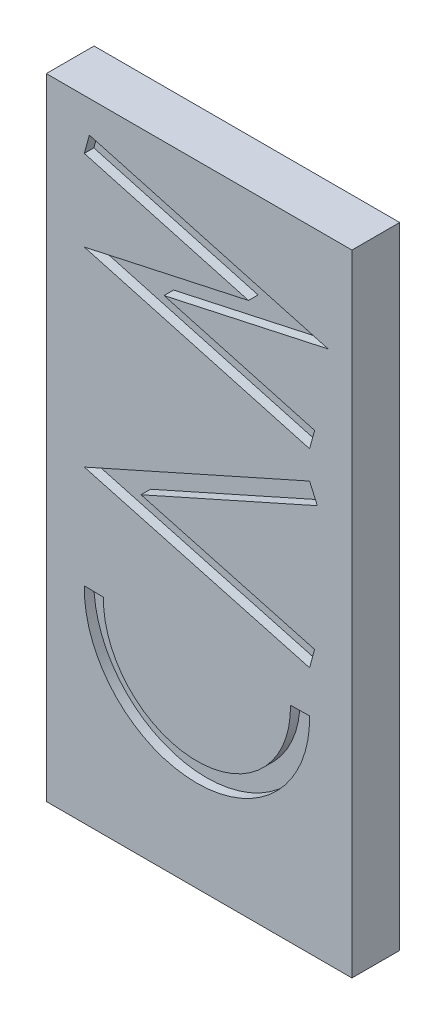
ISO-10303-21;
HEADER;
FILE_DESCRIPTION(('STEP AP214'),'2;1');
FILE_NAME('part.step','',(''),(''),'','','');
FILE_SCHEMA(('AUTOMOTIVE_DESIGN { 1 0 10303 214 1 1 1 1 }'));
ENDSEC;
DATA;
#1=APPLICATION_CONTEXT('core data for automotive mechanical design processes');
#2=APPLICATION_PROTOCOL_DEFINITION('international standard','automotive_design',2000,#1);
#3=PRODUCT_CONTEXT('',#1,'mechanical');
#4=PRODUCT('Part','Part','',(#3));
#5=PRODUCT_RELATED_PRODUCT_CATEGORY('part','',(#4));
#6=PRODUCT_DEFINITION_FORMATION('','',#4);
#7=PRODUCT_DEFINITION_CONTEXT('part definition',#1,'design');
#8=PRODUCT_DEFINITION('design','',#6,#7);
#9=PRODUCT_DEFINITION_SHAPE('','',#8);
#10=(LENGTH_UNIT() NAMED_UNIT(*) SI_UNIT(.MILLI.,.METRE.));
#11=(NAMED_UNIT(*) PLANE_ANGLE_UNIT() SI_UNIT($,.RADIAN.));
#12=(NAMED_UNIT(*) SI_UNIT($,.STERADIAN.) SOLID_ANGLE_UNIT());
#13=UNCERTAINTY_MEASURE_WITH_UNIT(LENGTH_MEASURE(1.E-05),#10,'distance_accuracy_value','');
#14=(GEOMETRIC_REPRESENTATION_CONTEXT(3) GLOBAL_UNCERTAINTY_ASSIGNED_CONTEXT((#13)) GLOBAL_UNIT_ASSIGNED_CONTEXT((#10,
#11,#12)) REPRESENTATION_CONTEXT('',''));
#15=CARTESIAN_POINT('',(0.,0.,0.));
#16=DIRECTION('',(0.,0.,1.));
#17=DIRECTION('',(1.,0.,0.));
#18=AXIS2_PLACEMENT_3D('',#15,#16,#17);
#19=CARTESIAN_POINT('',(-16.,33.,5.));
#20=DIRECTION('',(1.,0.,0.));
#21=DIRECTION('',(0.,1.,0.));
#22=AXIS2_PLACEMENT_3D('',#19,#20,#21);
#23=PLANE('',#22);
#24=DIRECTION('',(0.,-1.,0.));
#25=VECTOR('',#24,1.);
#26=CARTESIAN_POINT('',(-16.,33.,0.));
#27=LINE('',#26,#25);
#28=CARTESIAN_POINT('',(-16.,33.,0.));
#29=VERTEX_POINT('',#28);
#30=CARTESIAN_POINT('',(-16.,-33.,0.));
#31=VERTEX_POINT('',#30);
#32=EDGE_CURVE('E217',#29,#31,#27,.T.);
#33=ORIENTED_EDGE('',*,*,#32,.T.);
#34=DIRECTION('',(0.,0.,-1.));
#35=VECTOR('',#34,1.);
#36=CARTESIAN_POINT('',(-16.,-33.,5.));
#37=LINE('',#36,#35);
#38=CARTESIAN_POINT('',(-16.,-33.,5.));
#39=VERTEX_POINT('',#38);
#40=EDGE_CURVE('E11',#39,#31,#37,.T.);
#41=ORIENTED_EDGE('',*,*,#40,.F.);
#42=DIRECTION('',(0.,-1.,0.));
#43=VECTOR('',#42,1.);
#44=CARTESIAN_POINT('',(-16.,33.,5.));
#45=LINE('',#44,#43);
#46=CARTESIAN_POINT('',(-16.,33.,5.));
#47=VERTEX_POINT('',#46);
#48=EDGE_CURVE('E330',#47,#39,#45,.T.);
#49=ORIENTED_EDGE('',*,*,#48,.F.);
#50=DIRECTION('',(0.,0.,-1.));
#51=VECTOR('',#50,1.);
#52=CARTESIAN_POINT('',(-16.,33.,5.));
#53=LINE('',#52,#51);
#54=EDGE_CURVE('E340',#47,#29,#53,.T.);
#55=ORIENTED_EDGE('',*,*,#54,.T.);
#56=EDGE_LOOP('',(#33,#41,#49,#55));
#57=FACE_BOUND('',#56,.T.);
#58=ADVANCED_FACE('F33',(#57),#23,.F.);
#59=CARTESIAN_POINT('',(16.,-33.,5.));
#60=DIRECTION('',(0.,1.,0.));
#61=DIRECTION('',(0.,0.,1.));
#62=AXIS2_PLACEMENT_3D('',#59,#60,#61);
#63=PLANE('',#62);
#64=DIRECTION('',(1.,0.,0.));
#65=VECTOR('',#64,1.);
#66=CARTESIAN_POINT('',(16.,-33.,0.));
#67=LINE('',#66,#65);
#68=CARTESIAN_POINT('',(16.,-33.,0.));
#69=VERTEX_POINT('',#68);
#70=EDGE_CURVE('E343',#31,#69,#67,.T.);
#71=ORIENTED_EDGE('',*,*,#70,.T.);
#72=DIRECTION('',(0.,0.,-1.));
#73=VECTOR('',#72,1.);
#74=CARTESIAN_POINT('',(16.,-33.,5.));
#75=LINE('',#74,#73);
#76=CARTESIAN_POINT('',(16.,-33.,5.));
#77=VERTEX_POINT('',#76);
#78=EDGE_CURVE('E40',#77,#69,#75,.T.);
#79=ORIENTED_EDGE('',*,*,#78,.F.);
#80=DIRECTION('',(1.,0.,0.));
#81=VECTOR('',#80,1.);
#82=CARTESIAN_POINT('',(16.,-33.,5.));
#83=LINE('',#82,#81);
#84=EDGE_CURVE('E333',#39,#77,#83,.T.);
#85=ORIENTED_EDGE('',*,*,#84,.F.);
#86=ORIENTED_EDGE('',*,*,#40,.T.);
#87=EDGE_LOOP('',(#71,#79,#85,#86));
#88=FACE_BOUND('',#87,.T.);
#89=ADVANCED_FACE('F373',(#88),#63,.F.);
#90=CARTESIAN_POINT('',(16.,33.,5.));
#91=DIRECTION('',(-1.,0.,0.));
#92=DIRECTION('',(0.,-1.,0.));
#93=AXIS2_PLACEMENT_3D('',#90,#91,#92);
#94=PLANE('',#93);
#95=DIRECTION('',(0.,1.,0.));
#96=VECTOR('',#95,1.);
#97=CARTESIAN_POINT('',(16.,33.,0.));
#98=LINE('',#97,#96);
#99=CARTESIAN_POINT('',(16.,33.,0.));
#100=VERTEX_POINT('',#99);
#101=EDGE_CURVE('E345',#69,#100,#98,.T.);
#102=ORIENTED_EDGE('',*,*,#101,.T.);
#103=DIRECTION('',(0.,0.,-1.));
#104=VECTOR('',#103,1.);
#105=CARTESIAN_POINT('',(16.,33.,5.));
#106=LINE('',#105,#104);
#107=CARTESIAN_POINT('',(16.,33.,5.));
#108=VERTEX_POINT('',#107);
#109=EDGE_CURVE('E350',#108,#100,#106,.T.);
#110=ORIENTED_EDGE('',*,*,#109,.F.);
#111=DIRECTION('',(0.,1.,0.));
#112=VECTOR('',#111,1.);
#113=CARTESIAN_POINT('',(16.,33.,5.));
#114=LINE('',#113,#112);
#115=EDGE_CURVE('E336',#77,#108,#114,.T.);
#116=ORIENTED_EDGE('',*,*,#115,.F.);
#117=ORIENTED_EDGE('',*,*,#78,.T.);
#118=EDGE_LOOP('',(#102,#110,#116,#117));
#119=FACE_BOUND('',#118,.T.);
#120=ADVANCED_FACE('F357',(#119),#94,.F.);
#121=CARTESIAN_POINT('',(16.,33.,5.));
#122=DIRECTION('',(0.,-1.,0.));
#123=DIRECTION('',(1.,0.,0.));
#124=AXIS2_PLACEMENT_3D('',#121,#122,#123);
#125=PLANE('',#124);
#126=DIRECTION('',(-1.,0.,0.));
#127=VECTOR('',#126,1.);
#128=CARTESIAN_POINT('',(16.,33.,0.));
#129=LINE('',#128,#127);
#130=EDGE_CURVE('E334',#100,#29,#129,.T.);
#131=ORIENTED_EDGE('',*,*,#130,.T.);
#132=ORIENTED_EDGE('',*,*,#54,.F.);
#133=DIRECTION('',(-1.,0.,0.));
#134=VECTOR('',#133,1.);
#135=CARTESIAN_POINT('',(16.,33.,5.));
#136=LINE('',#135,#134);
#137=EDGE_CURVE('E338',#108,#47,#136,.T.);
#138=ORIENTED_EDGE('',*,*,#137,.F.);
#139=ORIENTED_EDGE('',*,*,#109,.T.);
#140=EDGE_LOOP('',(#131,#132,#138,#139));
#141=FACE_BOUND('',#140,.T.);
#142=ADVANCED_FACE('F366',(#141),#125,.F.);
#143=CARTESIAN_POINT('',(0.,0.,5.));
#144=DIRECTION('',(0.,0.,-1.));
#145=DIRECTION('',(-1.,0.,0.));
#146=AXIS2_PLACEMENT_3D('',#143,#144,#145);
#147=PLANE('',#146);
#148=DIRECTION('',(-0.999841920482624,0.0177801587624765,0.));
#149=VECTOR('',#148,1.);
#150=CARTESIAN_POINT('',(-10.0205274856944,-11.4847141502708,5.));
#151=LINE('',#150,#149);
#152=CARTESIAN_POINT('',(-10.0205274856944,-11.4847141502708,5.));
#153=VERTEX_POINT('',#152);
#154=CARTESIAN_POINT('',(-12.0202113266597,-11.4491538327458,5.));
#155=VERTEX_POINT('',#154);
#156=EDGE_CURVE('E210',#153,#155,#151,.T.);
#157=ORIENTED_EDGE('',*,*,#156,.F.);
#158=CARTESIAN_POINT('',(-0.228779166340051,-11.6588405157629,5.));
#159=DIRECTION('',(0.,0.,-1.));
#160=DIRECTION('',(1.,0.,0.));
#161=AXIS2_PLACEMENT_3D('',#158,#159,#160);
#162=CIRCLE('',#161,9.79329643892898);
#163=CARTESIAN_POINT('',(9.56296915301434,-11.4847141502708,5.));
#164=VERTEX_POINT('',#163);
#165=EDGE_CURVE('E47',#164,#153,#162,.T.);
#166=ORIENTED_EDGE('',*,*,#165,.F.);
#167=DIRECTION('',(-0.999841920482624,-0.0177801587624765,0.));
#168=VECTOR('',#167,1.);
#169=CARTESIAN_POINT('',(9.56296915301434,-11.4847141502708,5.));
#170=LINE('',#169,#168);
#171=CARTESIAN_POINT('',(11.5626529939796,-11.4491538327458,5.));
#172=VERTEX_POINT('',#171);
#173=EDGE_CURVE('E201',#172,#164,#170,.T.);
#174=ORIENTED_EDGE('',*,*,#173,.F.);
#175=CARTESIAN_POINT('',(-0.228779166340051,-11.6588405157629,5.));
#176=DIRECTION('',(0.,0.,1.));
#177=DIRECTION('',(1.,0.,0.));
#178=AXIS2_PLACEMENT_3D('',#175,#176,#177);
#179=CIRCLE('',#178,11.793296438929);
#180=EDGE_CURVE('E204',#155,#172,#179,.T.);
#181=ORIENTED_EDGE('',*,*,#180,.F.);
#182=EDGE_LOOP('',(#157,#166,#174,#181));
#183=FACE_BOUND('',#182,.T.);
#184=DIRECTION('',(-0.965032083007041,0.2621317965587,0.));
#185=VECTOR('',#184,1.);
#186=CARTESIAN_POINT('',(12.086916587097,-5.16208999052764,5.));
#187=LINE('',#186,#185);
#188=CARTESIAN_POINT('',(12.086916587097,-5.16208999052764,5.));
#189=VERTEX_POINT('',#188);
#190=CARTESIAN_POINT('',(-6.08248382403612,-0.226733274382114,5.));
#191=VERTEX_POINT('',#190);
#192=EDGE_CURVE('E242',#189,#191,#187,.T.);
#193=ORIENTED_EDGE('',*,*,#192,.F.);
#194=DIRECTION('',(0.2621317965587,0.965032083007041,0.));
#195=VECTOR('',#194,1.);
#196=CARTESIAN_POINT('',(11.5626529939796,-7.09215415654172,5.));
#197=LINE('',#196,#195);
#198=CARTESIAN_POINT('',(11.5626529939796,-7.09215415654172,5.));
#199=VERTEX_POINT('',#198);
#200=EDGE_CURVE('E55',#199,#189,#197,.T.);
#201=ORIENTED_EDGE('',*,*,#200,.F.);
#202=DIRECTION('',(0.965032083007041,-0.2621317965587,0.));
#203=VECTOR('',#202,1.);
#204=CARTESIAN_POINT('',(11.5626529939796,-7.09215415654172,5.));
#205=LINE('',#204,#203);
#206=CARTESIAN_POINT('',(-12.0202113266597,-0.68633749902015,5.));
#207=VERTEX_POINT('',#206);
#208=EDGE_CURVE('E225',#207,#199,#205,.T.);
#209=ORIENTED_EDGE('',*,*,#208,.F.);
#210=DIRECTION('',(-0.913198740621509,-0.407514490696085,0.));
#211=VECTOR('',#210,1.);
#212=CARTESIAN_POINT('',(-12.0202113266597,-0.68633749902015,5.));
#213=LINE('',#212,#211);
#214=CARTESIAN_POINT('',(11.5626529939796,9.83750415262242,5.));
#215=VERTEX_POINT('',#214);
#216=EDGE_CURVE('E252',#215,#207,#213,.T.);
#217=ORIENTED_EDGE('',*,*,#216,.F.);
#218=DIRECTION('',(-0.407514490696085,0.913198740621509,0.));
#219=VECTOR('',#218,1.);
#220=CARTESIAN_POINT('',(11.5626529939796,9.83750415262242,5.));
#221=LINE('',#220,#219);
#222=CARTESIAN_POINT('',(12.3776819753718,8.0111066713794,5.));
#223=VERTEX_POINT('',#222);
#224=EDGE_CURVE('E249',#223,#215,#221,.T.);
#225=ORIENTED_EDGE('',*,*,#224,.F.);
#226=DIRECTION('',(0.913198740621509,0.407514490696085,0.));
#227=VECTOR('',#226,1.);
#228=CARTESIAN_POINT('',(-6.08248382403612,-0.226733274382114,5.));
#229=LINE('',#228,#227);
#230=EDGE_CURVE('E246',#191,#223,#229,.T.);
#231=ORIENTED_EDGE('',*,*,#230,.F.);
#232=EDGE_LOOP('',(#193,#201,#209,#217,#225,#231));
#233=FACE_BOUND('',#232,.T.);
#234=DIRECTION('',(-0.964079438764656,0.265614072954025,0.));
#235=VECTOR('',#234,1.);
#236=CARTESIAN_POINT('',(12.0938811398876,14.6940363593045,5.));
#237=LINE('',#236,#235);
#238=CARTESIAN_POINT('',(12.0938811398876,14.6940363593045,5.));
#239=VERTEX_POINT('',#238);
#240=CARTESIAN_POINT('',(-3.67296917670923,19.0379702322372,5.));
#241=VERTEX_POINT('',#240);
#242=EDGE_CURVE('E295',#239,#241,#237,.T.);
#243=ORIENTED_EDGE('',*,*,#242,.F.);
#244=DIRECTION('',(0.265614072954025,0.964079438764656,0.));
#245=VECTOR('',#244,1.);
#246=CARTESIAN_POINT('',(11.5626529939796,12.7658774817751,5.));
#247=LINE('',#246,#245);
#248=CARTESIAN_POINT('',(11.5626529939796,12.7658774817751,5.));
#249=VERTEX_POINT('',#248);
#250=EDGE_CURVE('E293',#249,#239,#247,.T.);
#251=ORIENTED_EDGE('',*,*,#250,.F.);
#252=DIRECTION('',(0.964079438764656,-0.265614072954024,0.));
#253=VECTOR('',#252,1.);
#254=CARTESIAN_POINT('',(11.5626529939796,12.7658774817751,5.));
#255=LINE('',#254,#253);
#256=CARTESIAN_POINT('',(-12.0202113266597,19.2632058058327,5.));
#257=VERTEX_POINT('',#256);
#258=EDGE_CURVE('E271',#257,#249,#255,.T.);
#259=ORIENTED_EDGE('',*,*,#258,.F.);
#260=DIRECTION('',(-0.977000401022557,-0.213237464817425,0.));
#261=VECTOR('',#260,1.);
#262=CARTESIAN_POINT('',(-12.0202113266597,19.2632058058327,5.));
#263=LINE('',#262,#261);
#264=CARTESIAN_POINT('',(5.17040915928527,23.0151841338096,5.));
#265=VERTEX_POINT('',#264);
#266=EDGE_CURVE('E310',#265,#257,#263,.T.);
#267=ORIENTED_EDGE('',*,*,#266,.F.);
#268=DIRECTION('',(0.964079438764656,-0.265614072954024,0.));
#269=VECTOR('',#268,1.);
#270=CARTESIAN_POINT('',(5.17040915928527,23.0151841338096,5.));
#271=LINE('',#270,#269);
#272=CARTESIAN_POINT('',(-12.0202113266597,27.7513817335941,5.));
#273=VERTEX_POINT('',#272);
#274=EDGE_CURVE('E307',#273,#265,#271,.T.);
#275=ORIENTED_EDGE('',*,*,#274,.F.);
#276=DIRECTION('',(-0.265614072954025,-0.964079438764656,0.));
#277=VECTOR('',#276,1.);
#278=CARTESIAN_POINT('',(-12.0202113266597,27.7513817335941,5.));
#279=LINE('',#278,#277);
#280=CARTESIAN_POINT('',(-11.4889831807516,29.6795406111234,5.));
#281=VERTEX_POINT('',#280);
#282=EDGE_CURVE('E304',#281,#273,#279,.T.);
#283=ORIENTED_EDGE('',*,*,#282,.F.);
#284=DIRECTION('',(-0.964079438764656,0.265614072954024,0.));
#285=VECTOR('',#284,1.);
#286=CARTESIAN_POINT('',(13.5176513092357,22.7899485602141,5.));
#287=LINE('',#286,#285);
#288=CARTESIAN_POINT('',(13.5176513092357,22.7899485602141,5.));
#289=VERTEX_POINT('',#288);
#290=EDGE_CURVE('E301',#289,#281,#287,.T.);
#291=ORIENTED_EDGE('',*,*,#290,.F.);
#292=DIRECTION('',(0.977000401022557,0.213237464817425,0.));
#293=VECTOR('',#292,1.);
#294=CARTESIAN_POINT('',(-3.67296917670923,19.0379702322372,5.));
#295=LINE('',#294,#293);
#296=EDGE_CURVE('E298',#241,#289,#295,.T.);
#297=ORIENTED_EDGE('',*,*,#296,.F.);
#298=EDGE_LOOP('',(#243,#251,#259,#267,#275,#283,#291,#297));
#299=FACE_BOUND('',#298,.T.);
#300=ORIENTED_EDGE('',*,*,#48,.T.);
#301=ORIENTED_EDGE('',*,*,#84,.T.);
#302=ORIENTED_EDGE('',*,*,#115,.T.);
#303=ORIENTED_EDGE('',*,*,#137,.T.);
#304=EDGE_LOOP('',(#300,#301,#302,#303));
#305=FACE_BOUND('',#304,.T.);
#306=ADVANCED_FACE('F372',(#183,#233,#299,#305),#147,.F.);
#307=CARTESIAN_POINT('',(0.,0.,0.));
#308=DIRECTION('',(0.,0.,-1.));
#309=DIRECTION('',(-1.,0.,0.));
#310=AXIS2_PLACEMENT_3D('',#307,#308,#309);
#311=PLANE('',#310);
#312=ORIENTED_EDGE('',*,*,#32,.F.);
#313=ORIENTED_EDGE('',*,*,#130,.F.);
#314=ORIENTED_EDGE('',*,*,#101,.F.);
#315=ORIENTED_EDGE('',*,*,#70,.F.);
#316=EDGE_LOOP('',(#312,#313,#314,#315));
#317=FACE_BOUND('',#316,.T.);
#318=ADVANCED_FACE('F363',(#317),#311,.T.);
#319=CARTESIAN_POINT('',(11.5626529939796,12.7658774817751,4.));
#320=DIRECTION('',(0.964079438764656,-0.265614072954025,0.));
#321=DIRECTION('',(0.265614072954025,0.964079438764656,0.));
#322=AXIS2_PLACEMENT_3D('',#319,#320,#321);
#323=PLANE('',#322);
#324=ORIENTED_EDGE('',*,*,#250,.T.);
#325=DIRECTION('',(0.,0.,1.));
#326=VECTOR('',#325,1.);
#327=CARTESIAN_POINT('',(12.0938811398876,14.6940363593045,4.));
#328=LINE('',#327,#326);
#329=CARTESIAN_POINT('',(12.0938811398876,14.6940363593045,4.));
#330=VERTEX_POINT('',#329);
#331=EDGE_CURVE('E292',#330,#239,#328,.T.);
#332=ORIENTED_EDGE('',*,*,#331,.F.);
#333=DIRECTION('',(0.265614072954025,0.964079438764656,0.));
#334=VECTOR('',#333,1.);
#335=CARTESIAN_POINT('',(11.5626529939796,12.7658774817751,4.));
#336=LINE('',#335,#334);
#337=CARTESIAN_POINT('',(11.5626529939796,12.7658774817751,4.));
#338=VERTEX_POINT('',#337);
#339=EDGE_CURVE('E267',#338,#330,#336,.T.);
#340=ORIENTED_EDGE('',*,*,#339,.F.);
#341=DIRECTION('',(0.,0.,1.));
#342=VECTOR('',#341,1.);
#343=CARTESIAN_POINT('',(11.5626529939796,12.7658774817751,4.));
#344=LINE('',#343,#342);
#345=EDGE_CURVE('E243',#338,#249,#344,.T.);
#346=ORIENTED_EDGE('',*,*,#345,.T.);
#347=EDGE_LOOP('',(#324,#332,#340,#346));
#348=FACE_BOUND('',#347,.T.);
#349=ADVANCED_FACE('F385',(#348),#323,.F.);
#350=CARTESIAN_POINT('',(11.5626529939796,12.7658774817751,4.));
#351=DIRECTION('',(-0.265614072954024,-0.964079438764656,0.));
#352=DIRECTION('',(0.964079438764656,-0.265614072954024,0.));
#353=AXIS2_PLACEMENT_3D('',#350,#351,#352);
#354=PLANE('',#353);
#355=ORIENTED_EDGE('',*,*,#258,.T.);
#356=ORIENTED_EDGE('',*,*,#345,.F.);
#357=DIRECTION('',(0.964079438764656,-0.265614072954024,0.));
#358=VECTOR('',#357,1.);
#359=CARTESIAN_POINT('',(11.5626529939796,12.7658774817751,4.));
#360=LINE('',#359,#358);
#361=CARTESIAN_POINT('',(-12.0202113266597,19.2632058058327,4.));
#362=VERTEX_POINT('',#361);
#363=EDGE_CURVE('E289',#362,#338,#360,.T.);
#364=ORIENTED_EDGE('',*,*,#363,.F.);
#365=DIRECTION('',(0.,0.,1.));
#366=VECTOR('',#365,1.);
#367=CARTESIAN_POINT('',(-12.0202113266597,19.2632058058327,4.));
#368=LINE('',#367,#366);
#369=EDGE_CURVE('E316',#362,#257,#368,.T.);
#370=ORIENTED_EDGE('',*,*,#369,.T.);
#371=EDGE_LOOP('',(#355,#356,#364,#370));
#372=FACE_BOUND('',#371,.T.);
#373=ADVANCED_FACE('F391',(#372),#354,.F.);
#374=CARTESIAN_POINT('',(-12.0202113266597,19.2632058058327,4.));
#375=DIRECTION('',(-0.213237464817425,0.977000401022557,0.));
#376=DIRECTION('',(-0.977000401022557,-0.213237464817425,0.));
#377=AXIS2_PLACEMENT_3D('',#374,#375,#376);
#378=PLANE('',#377);
#379=ORIENTED_EDGE('',*,*,#266,.T.);
#380=ORIENTED_EDGE('',*,*,#369,.F.);
#381=DIRECTION('',(-0.977000401022557,-0.213237464817425,0.));
#382=VECTOR('',#381,1.);
#383=CARTESIAN_POINT('',(-12.0202113266597,19.2632058058327,4.));
#384=LINE('',#383,#382);
#385=CARTESIAN_POINT('',(5.17040915928527,23.0151841338096,4.));
#386=VERTEX_POINT('',#385);
#387=EDGE_CURVE('E286',#386,#362,#384,.T.);
#388=ORIENTED_EDGE('',*,*,#387,.F.);
#389=DIRECTION('',(0.,0.,1.));
#390=VECTOR('',#389,1.);
#391=CARTESIAN_POINT('',(5.17040915928527,23.0151841338096,4.));
#392=LINE('',#391,#390);
#393=EDGE_CURVE('E318',#386,#265,#392,.T.);
#394=ORIENTED_EDGE('',*,*,#393,.T.);
#395=EDGE_LOOP('',(#379,#380,#388,#394));
#396=FACE_BOUND('',#395,.T.);
#397=ADVANCED_FACE('F413',(#396),#378,.F.);
#398=CARTESIAN_POINT('',(5.17040915928527,23.0151841338096,4.));
#399=DIRECTION('',(-0.265614072954024,-0.964079438764656,0.));
#400=DIRECTION('',(0.964079438764656,-0.265614072954024,0.));
#401=AXIS2_PLACEMENT_3D('',#398,#399,#400);
#402=PLANE('',#401);
#403=ORIENTED_EDGE('',*,*,#274,.T.);
#404=ORIENTED_EDGE('',*,*,#393,.F.);
#405=DIRECTION('',(0.964079438764656,-0.265614072954024,0.));
#406=VECTOR('',#405,1.);
#407=CARTESIAN_POINT('',(5.17040915928527,23.0151841338096,4.));
#408=LINE('',#407,#406);
#409=CARTESIAN_POINT('',(-12.0202113266597,27.7513817335941,4.));
#410=VERTEX_POINT('',#409);
#411=EDGE_CURVE('E283',#410,#386,#408,.T.);
#412=ORIENTED_EDGE('',*,*,#411,.F.);
#413=DIRECTION('',(0.,0.,1.));
#414=VECTOR('',#413,1.);
#415=CARTESIAN_POINT('',(-12.0202113266597,27.7513817335941,4.));
#416=LINE('',#415,#414);
#417=EDGE_CURVE('E320',#410,#273,#416,.T.);
#418=ORIENTED_EDGE('',*,*,#417,.T.);
#419=EDGE_LOOP('',(#403,#404,#412,#418));
#420=FACE_BOUND('',#419,.T.);
#421=ADVANCED_FACE('F409',(#420),#402,.F.);
#422=CARTESIAN_POINT('',(-12.0202113266597,27.7513817335941,4.));
#423=DIRECTION('',(-0.964079438764656,0.265614072954025,0.));
#424=DIRECTION('',(-0.265614072954025,-0.964079438764656,0.));
#425=AXIS2_PLACEMENT_3D('',#422,#423,#424);
#426=PLANE('',#425);
#427=ORIENTED_EDGE('',*,*,#282,.T.);
#428=ORIENTED_EDGE('',*,*,#417,.F.);
#429=DIRECTION('',(-0.265614072954025,-0.964079438764656,0.));
#430=VECTOR('',#429,1.);
#431=CARTESIAN_POINT('',(-12.0202113266597,27.7513817335941,4.));
#432=LINE('',#431,#430);
#433=CARTESIAN_POINT('',(-11.4889831807516,29.6795406111234,4.));
#434=VERTEX_POINT('',#433);
#435=EDGE_CURVE('E280',#434,#410,#432,.T.);
#436=ORIENTED_EDGE('',*,*,#435,.F.);
#437=DIRECTION('',(0.,0.,1.));
#438=VECTOR('',#437,1.);
#439=CARTESIAN_POINT('',(-11.4889831807516,29.6795406111234,4.));
#440=LINE('',#439,#438);
#441=EDGE_CURVE('E322',#434,#281,#440,.T.);
#442=ORIENTED_EDGE('',*,*,#441,.T.);
#443=EDGE_LOOP('',(#427,#428,#436,#442));
#444=FACE_BOUND('',#443,.T.);
#445=ADVANCED_FACE('F405',(#444),#426,.F.);
#446=CARTESIAN_POINT('',(13.5176513092357,22.7899485602141,4.));
#447=DIRECTION('',(0.265614072954024,0.964079438764656,0.));
#448=DIRECTION('',(-0.964079438764656,0.265614072954024,0.));
#449=AXIS2_PLACEMENT_3D('',#446,#447,#448);
#450=PLANE('',#449);
#451=ORIENTED_EDGE('',*,*,#290,.T.);
#452=ORIENTED_EDGE('',*,*,#441,.F.);
#453=DIRECTION('',(-0.964079438764656,0.265614072954024,0.));
#454=VECTOR('',#453,1.);
#455=CARTESIAN_POINT('',(13.5176513092357,22.7899485602141,4.));
#456=LINE('',#455,#454);
#457=CARTESIAN_POINT('',(13.5176513092357,22.7899485602141,4.));
#458=VERTEX_POINT('',#457);
#459=EDGE_CURVE('E277',#458,#434,#456,.T.);
#460=ORIENTED_EDGE('',*,*,#459,.F.);
#461=DIRECTION('',(0.,0.,1.));
#462=VECTOR('',#461,1.);
#463=CARTESIAN_POINT('',(13.5176513092357,22.7899485602141,4.));
#464=LINE('',#463,#462);
#465=EDGE_CURVE('E324',#458,#289,#464,.T.);
#466=ORIENTED_EDGE('',*,*,#465,.T.);
#467=EDGE_LOOP('',(#451,#452,#460,#466));
#468=FACE_BOUND('',#467,.T.);
#469=ADVANCED_FACE('F401',(#468),#450,.F.);
#470=CARTESIAN_POINT('',(-3.67296917670923,19.0379702322372,4.));
#471=DIRECTION('',(0.213237464817425,-0.977000401022557,0.));
#472=DIRECTION('',(0.977000401022557,0.213237464817425,0.));
#473=AXIS2_PLACEMENT_3D('',#470,#471,#472);
#474=PLANE('',#473);
#475=ORIENTED_EDGE('',*,*,#296,.T.);
#476=ORIENTED_EDGE('',*,*,#465,.F.);
#477=DIRECTION('',(0.977000401022557,0.213237464817425,0.));
#478=VECTOR('',#477,1.);
#479=CARTESIAN_POINT('',(-3.67296917670923,19.0379702322372,4.));
#480=LINE('',#479,#478);
#481=CARTESIAN_POINT('',(-3.67296917670923,19.0379702322372,4.));
#482=VERTEX_POINT('',#481);
#483=EDGE_CURVE('E274',#482,#458,#480,.T.);
#484=ORIENTED_EDGE('',*,*,#483,.F.);
#485=DIRECTION('',(0.,0.,1.));
#486=VECTOR('',#485,1.);
#487=CARTESIAN_POINT('',(-3.67296917670923,19.0379702322372,4.));
#488=LINE('',#487,#486);
#489=EDGE_CURVE('E326',#482,#241,#488,.T.);
#490=ORIENTED_EDGE('',*,*,#489,.T.);
#491=EDGE_LOOP('',(#475,#476,#484,#490));
#492=FACE_BOUND('',#491,.T.);
#493=ADVANCED_FACE('F397',(#492),#474,.F.);
#494=CARTESIAN_POINT('',(12.0938811398876,14.6940363593045,4.));
#495=DIRECTION('',(0.265614072954025,0.964079438764656,0.));
#496=DIRECTION('',(-0.964079438764656,0.265614072954025,0.));
#497=AXIS2_PLACEMENT_3D('',#494,#495,#496);
#498=PLANE('',#497);
#499=ORIENTED_EDGE('',*,*,#242,.T.);
#500=ORIENTED_EDGE('',*,*,#489,.F.);
#501=DIRECTION('',(-0.964079438764656,0.265614072954025,0.));
#502=VECTOR('',#501,1.);
#503=CARTESIAN_POINT('',(12.0938811398876,14.6940363593045,4.));
#504=LINE('',#503,#502);
#505=EDGE_CURVE('E270',#330,#482,#504,.T.);
#506=ORIENTED_EDGE('',*,*,#505,.F.);
#507=ORIENTED_EDGE('',*,*,#331,.T.);
#508=EDGE_LOOP('',(#499,#500,#506,#507));
#509=FACE_BOUND('',#508,.T.);
#510=ADVANCED_FACE('F393',(#509),#498,.F.);
#511=CARTESIAN_POINT('',(0.,0.,4.));
#512=DIRECTION('',(0.,0.,1.));
#513=DIRECTION('',(1.,0.,0.));
#514=AXIS2_PLACEMENT_3D('',#511,#512,#513);
#515=PLANE('',#514);
#516=ORIENTED_EDGE('',*,*,#339,.T.);
#517=ORIENTED_EDGE('',*,*,#505,.T.);
#518=ORIENTED_EDGE('',*,*,#483,.T.);
#519=ORIENTED_EDGE('',*,*,#459,.T.);
#520=ORIENTED_EDGE('',*,*,#435,.T.);
#521=ORIENTED_EDGE('',*,*,#411,.T.);
#522=ORIENTED_EDGE('',*,*,#387,.T.);
#523=ORIENTED_EDGE('',*,*,#363,.T.);
#524=EDGE_LOOP('',(#516,#517,#518,#519,#520,#521,#522,#523));
#525=FACE_BOUND('',#524,.T.);
#526=ADVANCED_FACE('F396',(#525),#515,.T.);
#527=CARTESIAN_POINT('',(11.5626529939796,-7.09215415654172,4.));
#528=DIRECTION('',(0.965032083007041,-0.2621317965587,0.));
#529=DIRECTION('',(0.2621317965587,0.965032083007041,0.));
#530=AXIS2_PLACEMENT_3D('',#527,#528,#529);
#531=PLANE('',#530);
#532=ORIENTED_EDGE('',*,*,#200,.T.);
#533=DIRECTION('',(0.,0.,1.));
#534=VECTOR('',#533,1.);
#535=CARTESIAN_POINT('',(12.086916587097,-5.16208999052764,4.));
#536=LINE('',#535,#534);
#537=CARTESIAN_POINT('',(12.086916587097,-5.16208999052764,4.));
#538=VERTEX_POINT('',#537);
#539=EDGE_CURVE('E240',#538,#189,#536,.T.);
#540=ORIENTED_EDGE('',*,*,#539,.F.);
#541=DIRECTION('',(0.2621317965587,0.965032083007041,0.));
#542=VECTOR('',#541,1.);
#543=CARTESIAN_POINT('',(11.5626529939796,-7.09215415654172,4.));
#544=LINE('',#543,#542);
#545=CARTESIAN_POINT('',(11.5626529939796,-7.09215415654172,4.));
#546=VERTEX_POINT('',#545);
#547=EDGE_CURVE('E221',#546,#538,#544,.T.);
#548=ORIENTED_EDGE('',*,*,#547,.F.);
#549=DIRECTION('',(0.,0.,1.));
#550=VECTOR('',#549,1.);
#551=CARTESIAN_POINT('',(11.5626529939796,-7.09215415654172,4.));
#552=LINE('',#551,#550);
#553=EDGE_CURVE('E211',#546,#199,#552,.T.);
#554=ORIENTED_EDGE('',*,*,#553,.T.);
#555=EDGE_LOOP('',(#532,#540,#548,#554));
#556=FACE_BOUND('',#555,.T.);
#557=ADVANCED_FACE('F423',(#556),#531,.F.);
#558=CARTESIAN_POINT('',(11.5626529939796,-7.09215415654172,4.));
#559=DIRECTION('',(-0.2621317965587,-0.965032083007041,0.));
#560=DIRECTION('',(0.965032083007041,-0.2621317965587,0.));
#561=AXIS2_PLACEMENT_3D('',#558,#559,#560);
#562=PLANE('',#561);
#563=ORIENTED_EDGE('',*,*,#208,.T.);
#564=ORIENTED_EDGE('',*,*,#553,.F.);
#565=DIRECTION('',(0.965032083007041,-0.2621317965587,0.));
#566=VECTOR('',#565,1.);
#567=CARTESIAN_POINT('',(11.5626529939796,-7.09215415654172,4.));
#568=LINE('',#567,#566);
#569=CARTESIAN_POINT('',(-12.0202113266597,-0.68633749902015,4.));
#570=VERTEX_POINT('',#569);
#571=EDGE_CURVE('E237',#570,#546,#568,.T.);
#572=ORIENTED_EDGE('',*,*,#571,.F.);
#573=DIRECTION('',(0.,0.,1.));
#574=VECTOR('',#573,1.);
#575=CARTESIAN_POINT('',(-12.0202113266597,-0.68633749902015,4.));
#576=LINE('',#575,#574);
#577=EDGE_CURVE('E258',#570,#207,#576,.T.);
#578=ORIENTED_EDGE('',*,*,#577,.T.);
#579=EDGE_LOOP('',(#563,#564,#572,#578));
#580=FACE_BOUND('',#579,.T.);
#581=ADVANCED_FACE('F427',(#580),#562,.F.);
#582=CARTESIAN_POINT('',(-12.0202113266597,-0.68633749902015,4.));
#583=DIRECTION('',(-0.407514490696085,0.91319874062151,0.));
#584=DIRECTION('',(-0.91319874062151,-0.407514490696085,0.));
#585=AXIS2_PLACEMENT_3D('',#582,#583,#584);
#586=PLANE('',#585);
#587=ORIENTED_EDGE('',*,*,#216,.T.);
#588=ORIENTED_EDGE('',*,*,#577,.F.);
#589=DIRECTION('',(-0.913198740621509,-0.407514490696085,0.));
#590=VECTOR('',#589,1.);
#591=CARTESIAN_POINT('',(-12.0202113266597,-0.68633749902015,4.));
#592=LINE('',#591,#590);
#593=CARTESIAN_POINT('',(11.5626529939796,9.83750415262242,4.));
#594=VERTEX_POINT('',#593);
#595=EDGE_CURVE('E234',#594,#570,#592,.T.);
#596=ORIENTED_EDGE('',*,*,#595,.F.);
#597=DIRECTION('',(0.,0.,1.));
#598=VECTOR('',#597,1.);
#599=CARTESIAN_POINT('',(11.5626529939796,9.83750415262242,4.));
#600=LINE('',#599,#598);
#601=EDGE_CURVE('E260',#594,#215,#600,.T.);
#602=ORIENTED_EDGE('',*,*,#601,.T.);
#603=EDGE_LOOP('',(#587,#588,#596,#602));
#604=FACE_BOUND('',#603,.T.);
#605=ADVANCED_FACE('F440',(#604),#586,.F.);
#606=CARTESIAN_POINT('',(11.5626529939796,9.83750415262242,4.));
#607=DIRECTION('',(0.913198740621509,0.407514490696085,0.));
#608=DIRECTION('',(-0.407514490696085,0.913198740621509,0.));
#609=AXIS2_PLACEMENT_3D('',#606,#607,#608);
#610=PLANE('',#609);
#611=ORIENTED_EDGE('',*,*,#224,.T.);
#612=ORIENTED_EDGE('',*,*,#601,.F.);
#613=DIRECTION('',(-0.407514490696085,0.913198740621509,0.));
#614=VECTOR('',#613,1.);
#615=CARTESIAN_POINT('',(11.5626529939796,9.83750415262242,4.));
#616=LINE('',#615,#614);
#617=CARTESIAN_POINT('',(12.3776819753718,8.0111066713794,4.));
#618=VERTEX_POINT('',#617);
#619=EDGE_CURVE('E231',#618,#594,#616,.T.);
#620=ORIENTED_EDGE('',*,*,#619,.F.);
#621=DIRECTION('',(0.,0.,1.));
#622=VECTOR('',#621,1.);
#623=CARTESIAN_POINT('',(12.3776819753718,8.0111066713794,4.));
#624=LINE('',#623,#622);
#625=EDGE_CURVE('E262',#618,#223,#624,.T.);
#626=ORIENTED_EDGE('',*,*,#625,.T.);
#627=EDGE_LOOP('',(#611,#612,#620,#626));
#628=FACE_BOUND('',#627,.T.);
#629=ADVANCED_FACE('F436',(#628),#610,.F.);
#630=CARTESIAN_POINT('',(-6.08248382403612,-0.226733274382114,4.));
#631=DIRECTION('',(0.407514490696085,-0.91319874062151,0.));
#632=DIRECTION('',(0.91319874062151,0.407514490696085,0.));
#633=AXIS2_PLACEMENT_3D('',#630,#631,#632);
#634=PLANE('',#633);
#635=ORIENTED_EDGE('',*,*,#230,.T.);
#636=ORIENTED_EDGE('',*,*,#625,.F.);
#637=DIRECTION('',(0.913198740621509,0.407514490696085,0.));
#638=VECTOR('',#637,1.);
#639=CARTESIAN_POINT('',(-6.08248382403612,-0.226733274382114,4.));
#640=LINE('',#639,#638);
#641=CARTESIAN_POINT('',(-6.08248382403612,-0.226733274382114,4.));
#642=VERTEX_POINT('',#641);
#643=EDGE_CURVE('E228',#642,#618,#640,.T.);
#644=ORIENTED_EDGE('',*,*,#643,.F.);
#645=DIRECTION('',(0.,0.,1.));
#646=VECTOR('',#645,1.);
#647=CARTESIAN_POINT('',(-6.08248382403612,-0.226733274382114,4.));
#648=LINE('',#647,#646);
#649=EDGE_CURVE('E264',#642,#191,#648,.T.);
#650=ORIENTED_EDGE('',*,*,#649,.T.);
#651=EDGE_LOOP('',(#635,#636,#644,#650));
#652=FACE_BOUND('',#651,.T.);
#653=ADVANCED_FACE('F432',(#652),#634,.F.);
#654=CARTESIAN_POINT('',(12.086916587097,-5.16208999052764,4.));
#655=DIRECTION('',(0.2621317965587,0.965032083007041,0.));
#656=DIRECTION('',(-0.965032083007041,0.2621317965587,0.));
#657=AXIS2_PLACEMENT_3D('',#654,#655,#656);
#658=PLANE('',#657);
#659=ORIENTED_EDGE('',*,*,#192,.T.);
#660=ORIENTED_EDGE('',*,*,#649,.F.);
#661=DIRECTION('',(-0.965032083007041,0.2621317965587,0.));
#662=VECTOR('',#661,1.);
#663=CARTESIAN_POINT('',(12.086916587097,-5.16208999052764,4.));
#664=LINE('',#663,#662);
#665=EDGE_CURVE('E224',#538,#642,#664,.T.);
#666=ORIENTED_EDGE('',*,*,#665,.F.);
#667=ORIENTED_EDGE('',*,*,#539,.T.);
#668=EDGE_LOOP('',(#659,#660,#666,#667));
#669=FACE_BOUND('',#668,.T.);
#670=ADVANCED_FACE('F428',(#669),#658,.F.);
#671=CARTESIAN_POINT('',(0.,0.,4.));
#672=DIRECTION('',(0.,0.,1.));
#673=DIRECTION('',(1.,0.,0.));
#674=AXIS2_PLACEMENT_3D('',#671,#672,#673);
#675=PLANE('',#674);
#676=ORIENTED_EDGE('',*,*,#547,.T.);
#677=ORIENTED_EDGE('',*,*,#665,.T.);
#678=ORIENTED_EDGE('',*,*,#643,.T.);
#679=ORIENTED_EDGE('',*,*,#619,.T.);
#680=ORIENTED_EDGE('',*,*,#595,.T.);
#681=ORIENTED_EDGE('',*,*,#571,.T.);
#682=EDGE_LOOP('',(#676,#677,#678,#679,#680,#681));
#683=FACE_BOUND('',#682,.T.);
#684=ADVANCED_FACE('F431',(#683),#675,.T.);
#685=CARTESIAN_POINT('',(-0.228779166340051,-11.6588405157629,4.));
#686=DIRECTION('',(0.,0.,1.));
#687=DIRECTION('',(1.,0.,0.));
#688=AXIS2_PLACEMENT_3D('',#685,#686,#687);
#689=CYLINDRICAL_SURFACE('',#688,9.79329643892898);
#690=ORIENTED_EDGE('',*,*,#165,.T.);
#691=DIRECTION('',(0.,0.,1.));
#692=VECTOR('',#691,1.);
#693=CARTESIAN_POINT('',(-10.0205274856944,-11.4847141502708,4.));
#694=LINE('',#693,#692);
#695=CARTESIAN_POINT('',(-10.0205274856944,-11.4847141502708,4.));
#696=VERTEX_POINT('',#695);
#697=EDGE_CURVE('E179',#696,#153,#694,.T.);
#698=ORIENTED_EDGE('',*,*,#697,.F.);
#699=CARTESIAN_POINT('',(-0.228779166340051,-11.6588405157629,4.));
#700=DIRECTION('',(0.,0.,-1.));
#701=DIRECTION('',(1.,0.,0.));
#702=AXIS2_PLACEMENT_3D('',#699,#700,#701);
#703=CIRCLE('',#702,9.79329643892898);
#704=CARTESIAN_POINT('',(9.56296915301434,-11.4847141502708,4.));
#705=VERTEX_POINT('',#704);
#706=EDGE_CURVE('E183',#705,#696,#703,.T.);
#707=ORIENTED_EDGE('',*,*,#706,.F.);
#708=DIRECTION('',(0.,0.,1.));
#709=VECTOR('',#708,1.);
#710=CARTESIAN_POINT('',(9.56296915301434,-11.4847141502708,4.));
#711=LINE('',#710,#709);
#712=EDGE_CURVE('E215',#705,#164,#711,.T.);
#713=ORIENTED_EDGE('',*,*,#712,.T.);
#714=EDGE_LOOP('',(#690,#698,#707,#713));
#715=FACE_BOUND('',#714,.T.);
#716=ADVANCED_FACE('F181',(#715),#689,.T.);
#717=CARTESIAN_POINT('',(9.56296915301434,-11.4847141502708,4.));
#718=DIRECTION('',(-0.0177801587624765,0.999841920482624,0.));
#719=DIRECTION('',(-0.999841920482624,-0.0177801587624765,0.));
#720=AXIS2_PLACEMENT_3D('',#717,#718,#719);
#721=PLANE('',#720);
#722=ORIENTED_EDGE('',*,*,#173,.T.);
#723=ORIENTED_EDGE('',*,*,#712,.F.);
#724=DIRECTION('',(-0.999841920482624,-0.0177801587624765,0.));
#725=VECTOR('',#724,1.);
#726=CARTESIAN_POINT('',(9.56296915301434,-11.4847141502708,4.));
#727=LINE('',#726,#725);
#728=CARTESIAN_POINT('',(11.5626529939796,-11.4491538327458,4.));
#729=VERTEX_POINT('',#728);
#730=EDGE_CURVE('E189',#729,#705,#727,.T.);
#731=ORIENTED_EDGE('',*,*,#730,.F.);
#732=DIRECTION('',(0.,0.,1.));
#733=VECTOR('',#732,1.);
#734=CARTESIAN_POINT('',(11.5626529939796,-11.4491538327458,4.));
#735=LINE('',#734,#733);
#736=EDGE_CURVE('E218',#729,#172,#735,.T.);
#737=ORIENTED_EDGE('',*,*,#736,.T.);
#738=EDGE_LOOP('',(#722,#723,#731,#737));
#739=FACE_BOUND('',#738,.T.);
#740=ADVANCED_FACE('F453',(#739),#721,.F.);
#741=CARTESIAN_POINT('',(-0.228779166340051,-11.6588405157629,4.));
#742=DIRECTION('',(0.,0.,1.));
#743=DIRECTION('',(1.,0.,0.));
#744=AXIS2_PLACEMENT_3D('',#741,#742,#743);
#745=CYLINDRICAL_SURFACE('',#744,11.793296438929);
#746=ORIENTED_EDGE('',*,*,#180,.T.);
#747=ORIENTED_EDGE('',*,*,#736,.F.);
#748=CARTESIAN_POINT('',(-0.228779166340051,-11.6588405157629,4.));
#749=DIRECTION('',(0.,0.,1.));
#750=DIRECTION('',(1.,0.,0.));
#751=AXIS2_PLACEMENT_3D('',#748,#749,#750);
#752=CIRCLE('',#751,11.793296438929);
#753=CARTESIAN_POINT('',(-12.0202113266597,-11.4491538327458,4.));
#754=VERTEX_POINT('',#753);
#755=EDGE_CURVE('E197',#754,#729,#752,.T.);
#756=ORIENTED_EDGE('',*,*,#755,.F.);
#757=DIRECTION('',(0.,0.,1.));
#758=VECTOR('',#757,1.);
#759=CARTESIAN_POINT('',(-12.0202113266597,-11.4491538327458,4.));
#760=LINE('',#759,#758);
#761=EDGE_CURVE('E188',#754,#155,#760,.T.);
#762=ORIENTED_EDGE('',*,*,#761,.T.);
#763=EDGE_LOOP('',(#746,#747,#756,#762));
#764=FACE_BOUND('',#763,.T.);
#765=ADVANCED_FACE('F456',(#764),#745,.F.);
#766=CARTESIAN_POINT('',(-10.0205274856944,-11.4847141502708,4.));
#767=DIRECTION('',(0.0177801587624765,0.999841920482624,0.));
#768=DIRECTION('',(-0.999841920482624,0.0177801587624765,0.));
#769=AXIS2_PLACEMENT_3D('',#766,#767,#768);
#770=PLANE('',#769);
#771=ORIENTED_EDGE('',*,*,#156,.T.);
#772=ORIENTED_EDGE('',*,*,#761,.F.);
#773=DIRECTION('',(-0.999841920482624,0.0177801587624765,0.));
#774=VECTOR('',#773,1.);
#775=CARTESIAN_POINT('',(-10.0205274856944,-11.4847141502708,4.));
#776=LINE('',#775,#774);
#777=EDGE_CURVE('E192',#696,#754,#776,.T.);
#778=ORIENTED_EDGE('',*,*,#777,.F.);
#779=ORIENTED_EDGE('',*,*,#697,.T.);
#780=EDGE_LOOP('',(#771,#772,#778,#779));
#781=FACE_BOUND('',#780,.T.);
#782=ADVANCED_FACE('F193',(#781),#770,.F.);
#783=CARTESIAN_POINT('',(-0.228779166340051,-11.6588405157629,4.));
#784=DIRECTION('',(0.,0.,1.));
#785=DIRECTION('',(1.,0.,0.));
#786=AXIS2_PLACEMENT_3D('',#783,#784,#785);
#787=PLANE('',#786);
#788=ORIENTED_EDGE('',*,*,#706,.T.);
#789=ORIENTED_EDGE('',*,*,#777,.T.);
#790=ORIENTED_EDGE('',*,*,#755,.T.);
#791=ORIENTED_EDGE('',*,*,#730,.T.);
#792=EDGE_LOOP('',(#788,#789,#790,#791));
#793=FACE_BOUND('',#792,.T.);
#794=ADVANCED_FACE('F199',(#793),#787,.T.);
#795=CLOSED_SHELL('',(#58,#89,#120,#142,#306,#318,#349,#373,#397,#421,#445,#469,#493,#510,#526,
#557,#581,#605,#629,#653,#670,#684,#716,#740,#765,#782,#794));
#796=MANIFOLD_SOLID_BREP('B2',#795);
#797=ADVANCED_BREP_SHAPE_REPRESENTATION('',(#18,#796),#14);
#798=SHAPE_DEFINITION_REPRESENTATION(#9,#797);
ENDSEC;
END-ISO-10303-21;
